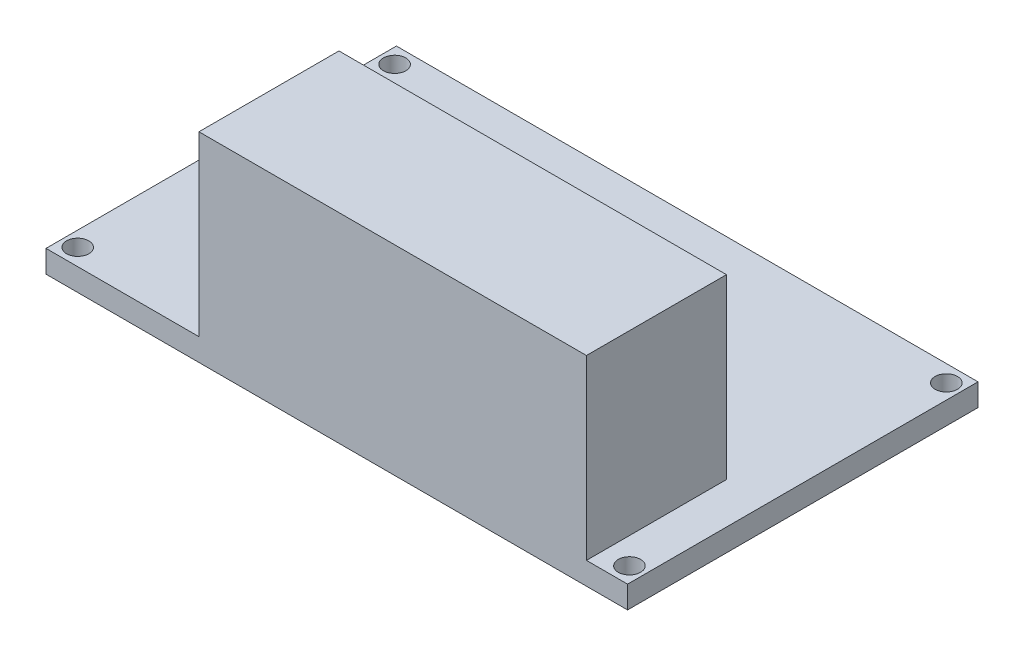
ISO-10303-21;
HEADER;
FILE_DESCRIPTION(('STEP AP214'),'2;1');
FILE_NAME('part.step','',(''),(''),'','','');
FILE_SCHEMA(('AUTOMOTIVE_DESIGN { 1 0 10303 214 1 1 1 1 }'));
ENDSEC;
DATA;
#1=APPLICATION_CONTEXT('core data for automotive mechanical design processes');
#2=APPLICATION_PROTOCOL_DEFINITION('international standard','automotive_design',2000,#1);
#3=PRODUCT_CONTEXT('',#1,'mechanical');
#4=PRODUCT('Part','Part','',(#3));
#5=PRODUCT_RELATED_PRODUCT_CATEGORY('part','',(#4));
#6=PRODUCT_DEFINITION_FORMATION('','',#4);
#7=PRODUCT_DEFINITION_CONTEXT('part definition',#1,'design');
#8=PRODUCT_DEFINITION('design','',#6,#7);
#9=PRODUCT_DEFINITION_SHAPE('','',#8);
#10=(LENGTH_UNIT() NAMED_UNIT(*) SI_UNIT(.MILLI.,.METRE.));
#11=(NAMED_UNIT(*) PLANE_ANGLE_UNIT() SI_UNIT($,.RADIAN.));
#12=(NAMED_UNIT(*) SI_UNIT($,.STERADIAN.) SOLID_ANGLE_UNIT());
#13=UNCERTAINTY_MEASURE_WITH_UNIT(LENGTH_MEASURE(1.E-05),#10,'distance_accuracy_value','');
#14=(GEOMETRIC_REPRESENTATION_CONTEXT(3) GLOBAL_UNCERTAINTY_ASSIGNED_CONTEXT((#13)) GLOBAL_UNIT_ASSIGNED_CONTEXT((#10,
#11,#12)) REPRESENTATION_CONTEXT('',''));
#15=CARTESIAN_POINT('',(0.,0.,0.));
#16=DIRECTION('',(0.,0.,1.));
#17=DIRECTION('',(1.,0.,0.));
#18=AXIS2_PLACEMENT_3D('',#15,#16,#17);
#19=CARTESIAN_POINT('',(0.,3.81,0.));
#20=DIRECTION('',(0.,-1.,0.));
#21=DIRECTION('',(0.,0.,-1.));
#22=AXIS2_PLACEMENT_3D('',#19,#20,#21);
#23=PLANE('',#22);
#24=CARTESIAN_POINT('',(-46.99,3.81,-26.9875));
#25=DIRECTION('',(0.,-1.,0.));
#26=DIRECTION('',(0.,0.,-1.));
#27=AXIS2_PLACEMENT_3D('',#24,#25,#26);
#28=CIRCLE('',#27,1.905);
#29=CARTESIAN_POINT('',(-46.99,3.81,-25.0825));
#30=VERTEX_POINT('',#29);
#31=EDGE_CURVE('E146',#30,#30,#28,.T.);
#32=ORIENTED_EDGE('',*,*,#31,.T.);
#33=EDGE_LOOP('',(#32));
#34=FACE_BOUND('',#33,.T.);
#35=CARTESIAN_POINT('',(46.99,3.81,-26.9875));
#36=DIRECTION('',(0.,-1.,0.));
#37=DIRECTION('',(0.,0.,-1.));
#38=AXIS2_PLACEMENT_3D('',#35,#36,#37);
#39=CIRCLE('',#38,1.905);
#40=CARTESIAN_POINT('',(46.99,3.81,-25.0825));
#41=VERTEX_POINT('',#40);
#42=EDGE_CURVE('E149',#41,#41,#39,.T.);
#43=ORIENTED_EDGE('',*,*,#42,.T.);
#44=EDGE_LOOP('',(#43));
#45=FACE_BOUND('',#44,.T.);
#46=CARTESIAN_POINT('',(46.99,3.81,26.9875));
#47=DIRECTION('',(0.,-1.,0.));
#48=DIRECTION('',(0.,0.,-1.));
#49=AXIS2_PLACEMENT_3D('',#46,#47,#48);
#50=CIRCLE('',#49,1.90500000000001);
#51=CARTESIAN_POINT('',(46.99,3.81,28.8925));
#52=VERTEX_POINT('',#51);
#53=EDGE_CURVE('E152',#52,#52,#50,.T.);
#54=ORIENTED_EDGE('',*,*,#53,.T.);
#55=EDGE_LOOP('',(#54));
#56=FACE_BOUND('',#55,.T.);
#57=CARTESIAN_POINT('',(-46.99,3.81,26.9875));
#58=DIRECTION('',(0.,-1.,0.));
#59=DIRECTION('',(0.,0.,-1.));
#60=AXIS2_PLACEMENT_3D('',#57,#58,#59);
#61=CIRCLE('',#60,1.90500000000001);
#62=CARTESIAN_POINT('',(-46.99,3.81,28.8925));
#63=VERTEX_POINT('',#62);
#64=EDGE_CURVE('E155',#63,#63,#61,.T.);
#65=ORIENTED_EDGE('',*,*,#64,.T.);
#66=EDGE_LOOP('',(#65));
#67=FACE_BOUND('',#66,.T.);
#68=DIRECTION('',(0.,0.,-1.));
#69=VECTOR('',#68,1.);
#70=CARTESIAN_POINT('',(42.5256241387592,3.81,29.845));
#71=LINE('',#70,#69);
#72=CARTESIAN_POINT('',(42.5256241387592,3.81,29.845));
#73=VERTEX_POINT('',#72);
#74=CARTESIAN_POINT('',(42.5256241387592,3.81,5.99591146032266));
#75=VERTEX_POINT('',#74);
#76=EDGE_CURVE('E64',#73,#75,#71,.T.);
#77=ORIENTED_EDGE('',*,*,#76,.F.);
#78=DIRECTION('',(1.,0.,0.));
#79=VECTOR('',#78,1.);
#80=CARTESIAN_POINT('',(-49.53,3.81,29.845));
#81=LINE('',#80,#79);
#82=CARTESIAN_POINT('',(49.53,3.81,29.845));
#83=VERTEX_POINT('',#82);
#84=EDGE_CURVE('E167',#73,#83,#81,.T.);
#85=ORIENTED_EDGE('',*,*,#84,.T.);
#86=DIRECTION('',(0.,0.,-1.));
#87=VECTOR('',#86,1.);
#88=CARTESIAN_POINT('',(49.53,3.81,29.845));
#89=LINE('',#88,#87);
#90=CARTESIAN_POINT('',(49.53,3.81,-29.845));
#91=VERTEX_POINT('',#90);
#92=EDGE_CURVE('E159',#83,#91,#89,.T.);
#93=ORIENTED_EDGE('',*,*,#92,.T.);
#94=DIRECTION('',(-1.,0.,0.));
#95=VECTOR('',#94,1.);
#96=CARTESIAN_POINT('',(-49.53,3.81,-29.845));
#97=LINE('',#96,#95);
#98=CARTESIAN_POINT('',(-49.53,3.81,-29.845));
#99=VERTEX_POINT('',#98);
#100=EDGE_CURVE('E162',#91,#99,#97,.T.);
#101=ORIENTED_EDGE('',*,*,#100,.T.);
#102=DIRECTION('',(0.,0.,1.));
#103=VECTOR('',#102,1.);
#104=CARTESIAN_POINT('',(-49.53,3.81,29.845));
#105=LINE('',#104,#103);
#106=CARTESIAN_POINT('',(-49.53,3.81,29.845));
#107=VERTEX_POINT('',#106);
#108=EDGE_CURVE('E165',#99,#107,#105,.T.);
#109=ORIENTED_EDGE('',*,*,#108,.T.);
#110=CARTESIAN_POINT('',(-23.4797877353813,3.81,29.845));
#111=VERTEX_POINT('',#110);
#112=EDGE_CURVE('E168',#107,#111,#81,.T.);
#113=ORIENTED_EDGE('',*,*,#112,.T.);
#114=DIRECTION('',(0.,0.,1.));
#115=VECTOR('',#114,1.);
#116=CARTESIAN_POINT('',(-23.4797877353813,3.81,29.845));
#117=LINE('',#116,#115);
#118=CARTESIAN_POINT('',(-23.4797877353813,3.81,5.99591146032266));
#119=VERTEX_POINT('',#118);
#120=EDGE_CURVE('E126',#119,#111,#117,.T.);
#121=ORIENTED_EDGE('',*,*,#120,.F.);
#122=DIRECTION('',(-1.,0.,0.));
#123=VECTOR('',#122,1.);
#124=CARTESIAN_POINT('',(42.5256241387592,3.81,5.99591146032266));
#125=LINE('',#124,#123);
#126=EDGE_CURVE('E59',#75,#119,#125,.T.);
#127=ORIENTED_EDGE('',*,*,#126,.F.);
#128=EDGE_LOOP('',(#77,#85,#93,#101,#109,#113,#121,#127));
#129=FACE_BOUND('',#128,.T.);
#130=ADVANCED_FACE('F44',(#34,#45,#56,#67,#129),#23,.F.);
#131=CARTESIAN_POINT('',(49.53,3.81,29.845));
#132=DIRECTION('',(-1.,0.,0.));
#133=DIRECTION('',(0.,0.,1.));
#134=AXIS2_PLACEMENT_3D('',#131,#132,#133);
#135=PLANE('',#134);
#136=DIRECTION('',(0.,0.,-1.));
#137=VECTOR('',#136,1.);
#138=CARTESIAN_POINT('',(49.53,0.,29.845));
#139=LINE('',#138,#137);
#140=CARTESIAN_POINT('',(49.53,0.,29.845));
#141=VERTEX_POINT('',#140);
#142=CARTESIAN_POINT('',(49.53,0.,-29.845));
#143=VERTEX_POINT('',#142);
#144=EDGE_CURVE('E158',#141,#143,#139,.T.);
#145=ORIENTED_EDGE('',*,*,#144,.T.);
#146=DIRECTION('',(0.,-1.,0.));
#147=VECTOR('',#146,1.);
#148=CARTESIAN_POINT('',(49.53,3.81,-29.845));
#149=LINE('',#148,#147);
#150=EDGE_CURVE('E11',#91,#143,#149,.T.);
#151=ORIENTED_EDGE('',*,*,#150,.F.);
#152=ORIENTED_EDGE('',*,*,#92,.F.);
#153=DIRECTION('',(0.,-1.,0.));
#154=VECTOR('',#153,1.);
#155=CARTESIAN_POINT('',(49.53,3.81,29.845));
#156=LINE('',#155,#154);
#157=EDGE_CURVE('E170',#83,#141,#156,.T.);
#158=ORIENTED_EDGE('',*,*,#157,.T.);
#159=EDGE_LOOP('',(#145,#151,#152,#158));
#160=FACE_BOUND('',#159,.T.);
#161=ADVANCED_FACE('F46',(#160),#135,.F.);
#162=CARTESIAN_POINT('',(-49.53,3.81,-29.845));
#163=DIRECTION('',(0.,0.,1.));
#164=DIRECTION('',(1.,0.,0.));
#165=AXIS2_PLACEMENT_3D('',#162,#163,#164);
#166=PLANE('',#165);
#167=DIRECTION('',(-1.,0.,0.));
#168=VECTOR('',#167,1.);
#169=CARTESIAN_POINT('',(-49.53,0.,-29.845));
#170=LINE('',#169,#168);
#171=CARTESIAN_POINT('',(-49.53,0.,-29.845));
#172=VERTEX_POINT('',#171);
#173=EDGE_CURVE('E173',#143,#172,#170,.T.);
#174=ORIENTED_EDGE('',*,*,#173,.T.);
#175=DIRECTION('',(0.,-1.,0.));
#176=VECTOR('',#175,1.);
#177=CARTESIAN_POINT('',(-49.53,3.81,-29.845));
#178=LINE('',#177,#176);
#179=EDGE_CURVE('E52',#99,#172,#178,.T.);
#180=ORIENTED_EDGE('',*,*,#179,.F.);
#181=ORIENTED_EDGE('',*,*,#100,.F.);
#182=ORIENTED_EDGE('',*,*,#150,.T.);
#183=EDGE_LOOP('',(#174,#180,#181,#182));
#184=FACE_BOUND('',#183,.T.);
#185=ADVANCED_FACE('F229',(#184),#166,.F.);
#186=CARTESIAN_POINT('',(-49.53,3.81,29.845));
#187=DIRECTION('',(1.,0.,0.));
#188=DIRECTION('',(0.,0.,-1.));
#189=AXIS2_PLACEMENT_3D('',#186,#187,#188);
#190=PLANE('',#189);
#191=DIRECTION('',(0.,0.,1.));
#192=VECTOR('',#191,1.);
#193=CARTESIAN_POINT('',(-49.53,0.,29.845));
#194=LINE('',#193,#192);
#195=CARTESIAN_POINT('',(-49.53,0.,29.845));
#196=VERTEX_POINT('',#195);
#197=EDGE_CURVE('E175',#172,#196,#194,.T.);
#198=ORIENTED_EDGE('',*,*,#197,.T.);
#199=DIRECTION('',(0.,-1.,0.));
#200=VECTOR('',#199,1.);
#201=CARTESIAN_POINT('',(-49.53,3.81,29.845));
#202=LINE('',#201,#200);
#203=EDGE_CURVE('E180',#107,#196,#202,.T.);
#204=ORIENTED_EDGE('',*,*,#203,.F.);
#205=ORIENTED_EDGE('',*,*,#108,.F.);
#206=ORIENTED_EDGE('',*,*,#179,.T.);
#207=EDGE_LOOP('',(#198,#204,#205,#206));
#208=FACE_BOUND('',#207,.T.);
#209=ADVANCED_FACE('F187',(#208),#190,.F.);
#210=CARTESIAN_POINT('',(-49.53,3.81,29.845));
#211=DIRECTION('',(0.,0.,-1.));
#212=DIRECTION('',(-1.,0.,0.));
#213=AXIS2_PLACEMENT_3D('',#210,#211,#212);
#214=PLANE('',#213);
#215=DIRECTION('',(1.,0.,0.));
#216=VECTOR('',#215,1.);
#217=CARTESIAN_POINT('',(-49.53,0.,29.845));
#218=LINE('',#217,#216);
#219=EDGE_CURVE('E163',#196,#141,#218,.T.);
#220=ORIENTED_EDGE('',*,*,#219,.T.);
#221=ORIENTED_EDGE('',*,*,#157,.F.);
#222=ORIENTED_EDGE('',*,*,#84,.F.);
#223=DIRECTION('',(0.,-1.,0.));
#224=VECTOR('',#223,1.);
#225=CARTESIAN_POINT('',(42.5256241387592,34.036,29.845));
#226=LINE('',#225,#224);
#227=CARTESIAN_POINT('',(42.5256241387592,34.036,29.845));
#228=VERTEX_POINT('',#227);
#229=EDGE_CURVE('E201',#228,#73,#226,.T.);
#230=ORIENTED_EDGE('',*,*,#229,.F.);
#231=DIRECTION('',(1.,0.,0.));
#232=VECTOR('',#231,1.);
#233=CARTESIAN_POINT('',(42.5256241387592,34.036,29.845));
#234=LINE('',#233,#232);
#235=CARTESIAN_POINT('',(-23.4797877353813,34.036,29.845));
#236=VERTEX_POINT('',#235);
#237=EDGE_CURVE('E122',#236,#228,#234,.T.);
#238=ORIENTED_EDGE('',*,*,#237,.F.);
#239=DIRECTION('',(0.,-1.,0.));
#240=VECTOR('',#239,1.);
#241=CARTESIAN_POINT('',(-23.4797877353813,34.036,29.845));
#242=LINE('',#241,#240);
#243=EDGE_CURVE('E134',#236,#111,#242,.T.);
#244=ORIENTED_EDGE('',*,*,#243,.T.);
#245=ORIENTED_EDGE('',*,*,#112,.F.);
#246=ORIENTED_EDGE('',*,*,#203,.T.);
#247=EDGE_LOOP('',(#220,#221,#222,#230,#238,#244,#245,#246));
#248=FACE_BOUND('',#247,.T.);
#249=ADVANCED_FACE('F196',(#248),#214,.F.);
#250=CARTESIAN_POINT('',(0.,0.,0.));
#251=DIRECTION('',(0.,-1.,0.));
#252=DIRECTION('',(0.,0.,-1.));
#253=AXIS2_PLACEMENT_3D('',#250,#251,#252);
#254=PLANE('',#253);
#255=CARTESIAN_POINT('',(-46.99,0.,26.9875));
#256=DIRECTION('',(0.,1.,0.));
#257=DIRECTION('',(0.,0.,1.));
#258=AXIS2_PLACEMENT_3D('',#255,#256,#257);
#259=CIRCLE('',#258,1.90500000000001);
#260=CARTESIAN_POINT('',(-46.99,0.,28.8925));
#261=VERTEX_POINT('',#260);
#262=EDGE_CURVE('E129',#261,#261,#259,.T.);
#263=ORIENTED_EDGE('',*,*,#262,.T.);
#264=EDGE_LOOP('',(#263));
#265=FACE_BOUND('',#264,.T.);
#266=CARTESIAN_POINT('',(46.99,0.,26.9875));
#267=DIRECTION('',(0.,1.,0.));
#268=DIRECTION('',(0.,0.,1.));
#269=AXIS2_PLACEMENT_3D('',#266,#267,#268);
#270=CIRCLE('',#269,1.90500000000001);
#271=CARTESIAN_POINT('',(46.99,0.,28.8925));
#272=VERTEX_POINT('',#271);
#273=EDGE_CURVE('E132',#272,#272,#270,.T.);
#274=ORIENTED_EDGE('',*,*,#273,.T.);
#275=EDGE_LOOP('',(#274));
#276=FACE_BOUND('',#275,.T.);
#277=CARTESIAN_POINT('',(46.99,0.,-26.9875));
#278=DIRECTION('',(0.,1.,0.));
#279=DIRECTION('',(0.,0.,1.));
#280=AXIS2_PLACEMENT_3D('',#277,#278,#279);
#281=CIRCLE('',#280,1.905);
#282=CARTESIAN_POINT('',(46.99,0.,-25.0825));
#283=VERTEX_POINT('',#282);
#284=EDGE_CURVE('E138',#283,#283,#281,.T.);
#285=ORIENTED_EDGE('',*,*,#284,.T.);
#286=EDGE_LOOP('',(#285));
#287=FACE_BOUND('',#286,.T.);
#288=CARTESIAN_POINT('',(-46.99,0.,-26.9875));
#289=DIRECTION('',(0.,1.,0.));
#290=DIRECTION('',(0.,0.,1.));
#291=AXIS2_PLACEMENT_3D('',#288,#289,#290);
#292=CIRCLE('',#291,1.905);
#293=CARTESIAN_POINT('',(-46.99,0.,-25.0825));
#294=VERTEX_POINT('',#293);
#295=EDGE_CURVE('E141',#294,#294,#292,.T.);
#296=ORIENTED_EDGE('',*,*,#295,.T.);
#297=EDGE_LOOP('',(#296));
#298=FACE_BOUND('',#297,.T.);
#299=ORIENTED_EDGE('',*,*,#144,.F.);
#300=ORIENTED_EDGE('',*,*,#219,.F.);
#301=ORIENTED_EDGE('',*,*,#197,.F.);
#302=ORIENTED_EDGE('',*,*,#173,.F.);
#303=EDGE_LOOP('',(#299,#300,#301,#302));
#304=FACE_BOUND('',#303,.T.);
#305=ADVANCED_FACE('F193',(#265,#276,#287,#298,#304),#254,.T.);
#306=CARTESIAN_POINT('',(-46.99,0.,-26.9875));
#307=DIRECTION('',(0.,1.,0.));
#308=DIRECTION('',(0.,0.,1.));
#309=AXIS2_PLACEMENT_3D('',#306,#307,#308);
#310=CYLINDRICAL_SURFACE('',#309,1.905);
#311=CARTESIAN_POINT('',(-46.99,0.,-25.0825));
#312=CARTESIAN_POINT('',(-46.99,0.0396874999999999,-25.0825));
#313=CARTESIAN_POINT('',(-46.99,0.079375,-25.0825));
#314=CARTESIAN_POINT('',(-46.99,0.15875,-25.0825));
#315=CARTESIAN_POINT('',(-46.99,0.1984375,-25.0825));
#316=CARTESIAN_POINT('',(-46.99,0.2778125,-25.0825));
#317=CARTESIAN_POINT('',(-46.99,0.3175,-25.0825));
#318=CARTESIAN_POINT('',(-46.99,0.396875,-25.0825));
#319=CARTESIAN_POINT('',(-46.99,0.4365625,-25.0825));
#320=CARTESIAN_POINT('',(-46.99,0.5159375,-25.0825));
#321=CARTESIAN_POINT('',(-46.99,0.555625,-25.0825));
#322=CARTESIAN_POINT('',(-46.99,0.635,-25.0825));
#323=CARTESIAN_POINT('',(-46.99,0.6746875,-25.0825));
#324=CARTESIAN_POINT('',(-46.99,0.7540625,-25.0825));
#325=CARTESIAN_POINT('',(-46.99,0.79375,-25.0825));
#326=CARTESIAN_POINT('',(-46.99,0.873125,-25.0825));
#327=CARTESIAN_POINT('',(-46.99,0.9128125,-25.0825));
#328=CARTESIAN_POINT('',(-46.99,0.9921875,-25.0825));
#329=CARTESIAN_POINT('',(-46.99,1.031875,-25.0825));
#330=CARTESIAN_POINT('',(-46.99,1.11125,-25.0825));
#331=CARTESIAN_POINT('',(-46.99,1.1509375,-25.0825));
#332=CARTESIAN_POINT('',(-46.99,1.2303125,-25.0825));
#333=CARTESIAN_POINT('',(-46.99,1.27,-25.0825));
#334=CARTESIAN_POINT('',(-46.99,1.349375,-25.0825));
#335=CARTESIAN_POINT('',(-46.99,1.3890625,-25.0825));
#336=CARTESIAN_POINT('',(-46.99,1.4684375,-25.0825));
#337=CARTESIAN_POINT('',(-46.99,1.508125,-25.0825));
#338=CARTESIAN_POINT('',(-46.99,1.5875,-25.0825));
#339=CARTESIAN_POINT('',(-46.99,1.6271875,-25.0825));
#340=CARTESIAN_POINT('',(-46.99,1.7065625,-25.0825));
#341=CARTESIAN_POINT('',(-46.99,1.74625,-25.0825));
#342=CARTESIAN_POINT('',(-46.99,1.825625,-25.0825));
#343=CARTESIAN_POINT('',(-46.99,1.8653125,-25.0825));
#344=CARTESIAN_POINT('',(-46.99,1.9446875,-25.0825));
#345=CARTESIAN_POINT('',(-46.99,1.984375,-25.0825));
#346=CARTESIAN_POINT('',(-46.99,2.06375,-25.0825));
#347=CARTESIAN_POINT('',(-46.99,2.1034375,-25.0825));
#348=CARTESIAN_POINT('',(-46.99,2.1828125,-25.0825));
#349=CARTESIAN_POINT('',(-46.99,2.2225,-25.0825));
#350=CARTESIAN_POINT('',(-46.99,2.301875,-25.0825));
#351=CARTESIAN_POINT('',(-46.99,2.3415625,-25.0825));
#352=CARTESIAN_POINT('',(-46.99,2.4209375,-25.0825));
#353=CARTESIAN_POINT('',(-46.99,2.460625,-25.0825));
#354=CARTESIAN_POINT('',(-46.99,2.54,-25.0825));
#355=CARTESIAN_POINT('',(-46.99,2.5796875,-25.0825));
#356=CARTESIAN_POINT('',(-46.99,2.6590625,-25.0825));
#357=CARTESIAN_POINT('',(-46.99,2.69875,-25.0825));
#358=CARTESIAN_POINT('',(-46.99,2.778125,-25.0825));
#359=CARTESIAN_POINT('',(-46.99,2.8178125,-25.0825));
#360=CARTESIAN_POINT('',(-46.99,2.8971875,-25.0825));
#361=CARTESIAN_POINT('',(-46.99,2.936875,-25.0825));
#362=CARTESIAN_POINT('',(-46.99,3.01625,-25.0825));
#363=CARTESIAN_POINT('',(-46.99,3.0559375,-25.0825));
#364=CARTESIAN_POINT('',(-46.99,3.1353125,-25.0825));
#365=CARTESIAN_POINT('',(-46.99,3.175,-25.0825));
#366=CARTESIAN_POINT('',(-46.99,3.254375,-25.0825));
#367=CARTESIAN_POINT('',(-46.99,3.2940625,-25.0825));
#368=CARTESIAN_POINT('',(-46.99,3.3734375,-25.0825));
#369=CARTESIAN_POINT('',(-46.99,3.413125,-25.0825));
#370=CARTESIAN_POINT('',(-46.99,3.4925,-25.0825));
#371=CARTESIAN_POINT('',(-46.99,3.5321875,-25.0825));
#372=CARTESIAN_POINT('',(-46.99,3.6115625,-25.0825));
#373=CARTESIAN_POINT('',(-46.99,3.65125,-25.0825));
#374=CARTESIAN_POINT('',(-46.99,3.730625,-25.0825));
#375=CARTESIAN_POINT('',(-46.99,3.7703125,-25.0825));
#376=CARTESIAN_POINT('',(-46.99,3.81,-25.0825));
#377=B_SPLINE_CURVE_WITH_KNOTS('',3,(#311,#312,#313,#314,#315,#316,#317,#318,#319,#320,#321,
#322,#323,#324,#325,#326,#327,#328,#329,#330,#331,#332,#333,#334,#335,#336,#337,#338,#339,#340,
#341,#342,#343,#344,#345,#346,#347,#348,#349,#350,#351,#352,#353,#354,#355,#356,#357,#358,#359,
#360,#361,#362,#363,#364,#365,#366,#367,#368,#369,#370,#371,#372,#373,#374,#375,#376),
.UNSPECIFIED.,.F.,.F.,(4,2,2,2,2,2,2,2,2,2,2,2,2,2,2,2,2,2,2,2,2,2,2,2,2,2,2,2,2,2,2,2,4),(0.,
0.1190625,0.238125,0.3571875,0.47625,0.5953125,0.714375,0.8334375,0.9525,1.0715625,1.190625,
1.3096875,1.42875,1.5478125,1.666875,1.7859375,1.905,2.0240625,2.143125,2.2621875,2.38125,
2.5003125,2.619375,2.7384375,2.8575,2.9765625,3.095625,3.2146875,3.33375,3.4528125,3.571875,
3.6909375,3.81),.UNSPECIFIED.);
#378=EDGE_CURVE('BSEAM233',#294,#30,#377,.T.);
#379=ORIENTED_EDGE('',*,*,#295,.F.);
#380=ORIENTED_EDGE('',*,*,#31,.F.);
#381=ORIENTED_EDGE('',*,*,#378,.T.);
#382=ORIENTED_EDGE('',*,*,#378,.F.);
#383=EDGE_LOOP('',(#379,#381,#380,#382));
#384=FACE_BOUND('',#383,.T.);
#385=ADVANCED_FACE('F233',(#384),#310,.F.);
#386=CARTESIAN_POINT('',(46.99,0.,-26.9875));
#387=DIRECTION('',(0.,1.,0.));
#388=DIRECTION('',(0.,0.,1.));
#389=AXIS2_PLACEMENT_3D('',#386,#387,#388);
#390=CYLINDRICAL_SURFACE('',#389,1.905);
#391=CARTESIAN_POINT('',(46.99,0.,-25.0825));
#392=CARTESIAN_POINT('',(46.99,0.0396874999999999,-25.0825));
#393=CARTESIAN_POINT('',(46.99,0.079375,-25.0825));
#394=CARTESIAN_POINT('',(46.99,0.15875,-25.0825));
#395=CARTESIAN_POINT('',(46.99,0.1984375,-25.0825));
#396=CARTESIAN_POINT('',(46.99,0.2778125,-25.0825));
#397=CARTESIAN_POINT('',(46.99,0.3175,-25.0825));
#398=CARTESIAN_POINT('',(46.99,0.396875,-25.0825));
#399=CARTESIAN_POINT('',(46.99,0.4365625,-25.0825));
#400=CARTESIAN_POINT('',(46.99,0.5159375,-25.0825));
#401=CARTESIAN_POINT('',(46.99,0.555625,-25.0825));
#402=CARTESIAN_POINT('',(46.99,0.635,-25.0825));
#403=CARTESIAN_POINT('',(46.99,0.6746875,-25.0825));
#404=CARTESIAN_POINT('',(46.99,0.7540625,-25.0825));
#405=CARTESIAN_POINT('',(46.99,0.79375,-25.0825));
#406=CARTESIAN_POINT('',(46.99,0.873125,-25.0825));
#407=CARTESIAN_POINT('',(46.99,0.9128125,-25.0825));
#408=CARTESIAN_POINT('',(46.99,0.9921875,-25.0825));
#409=CARTESIAN_POINT('',(46.99,1.031875,-25.0825));
#410=CARTESIAN_POINT('',(46.99,1.11125,-25.0825));
#411=CARTESIAN_POINT('',(46.99,1.1509375,-25.0825));
#412=CARTESIAN_POINT('',(46.99,1.2303125,-25.0825));
#413=CARTESIAN_POINT('',(46.99,1.27,-25.0825));
#414=CARTESIAN_POINT('',(46.99,1.349375,-25.0825));
#415=CARTESIAN_POINT('',(46.99,1.3890625,-25.0825));
#416=CARTESIAN_POINT('',(46.99,1.4684375,-25.0825));
#417=CARTESIAN_POINT('',(46.99,1.508125,-25.0825));
#418=CARTESIAN_POINT('',(46.99,1.5875,-25.0825));
#419=CARTESIAN_POINT('',(46.99,1.6271875,-25.0825));
#420=CARTESIAN_POINT('',(46.99,1.7065625,-25.0825));
#421=CARTESIAN_POINT('',(46.99,1.74625,-25.0825));
#422=CARTESIAN_POINT('',(46.99,1.825625,-25.0825));
#423=CARTESIAN_POINT('',(46.99,1.8653125,-25.0825));
#424=CARTESIAN_POINT('',(46.99,1.9446875,-25.0825));
#425=CARTESIAN_POINT('',(46.99,1.984375,-25.0825));
#426=CARTESIAN_POINT('',(46.99,2.06375,-25.0825));
#427=CARTESIAN_POINT('',(46.99,2.1034375,-25.0825));
#428=CARTESIAN_POINT('',(46.99,2.1828125,-25.0825));
#429=CARTESIAN_POINT('',(46.99,2.2225,-25.0825));
#430=CARTESIAN_POINT('',(46.99,2.301875,-25.0825));
#431=CARTESIAN_POINT('',(46.99,2.3415625,-25.0825));
#432=CARTESIAN_POINT('',(46.99,2.4209375,-25.0825));
#433=CARTESIAN_POINT('',(46.99,2.460625,-25.0825));
#434=CARTESIAN_POINT('',(46.99,2.54,-25.0825));
#435=CARTESIAN_POINT('',(46.99,2.5796875,-25.0825));
#436=CARTESIAN_POINT('',(46.99,2.6590625,-25.0825));
#437=CARTESIAN_POINT('',(46.99,2.69875,-25.0825));
#438=CARTESIAN_POINT('',(46.99,2.778125,-25.0825));
#439=CARTESIAN_POINT('',(46.99,2.8178125,-25.0825));
#440=CARTESIAN_POINT('',(46.99,2.8971875,-25.0825));
#441=CARTESIAN_POINT('',(46.99,2.936875,-25.0825));
#442=CARTESIAN_POINT('',(46.99,3.01625,-25.0825));
#443=CARTESIAN_POINT('',(46.99,3.0559375,-25.0825));
#444=CARTESIAN_POINT('',(46.99,3.1353125,-25.0825));
#445=CARTESIAN_POINT('',(46.99,3.175,-25.0825));
#446=CARTESIAN_POINT('',(46.99,3.254375,-25.0825));
#447=CARTESIAN_POINT('',(46.99,3.2940625,-25.0825));
#448=CARTESIAN_POINT('',(46.99,3.3734375,-25.0825));
#449=CARTESIAN_POINT('',(46.99,3.413125,-25.0825));
#450=CARTESIAN_POINT('',(46.99,3.4925,-25.0825));
#451=CARTESIAN_POINT('',(46.99,3.5321875,-25.0825));
#452=CARTESIAN_POINT('',(46.99,3.6115625,-25.0825));
#453=CARTESIAN_POINT('',(46.99,3.65125,-25.0825));
#454=CARTESIAN_POINT('',(46.99,3.730625,-25.0825));
#455=CARTESIAN_POINT('',(46.99,3.7703125,-25.0825));
#456=CARTESIAN_POINT('',(46.99,3.81,-25.0825));
#457=B_SPLINE_CURVE_WITH_KNOTS('',3,(#391,#392,#393,#394,#395,#396,#397,#398,#399,#400,#401,
#402,#403,#404,#405,#406,#407,#408,#409,#410,#411,#412,#413,#414,#415,#416,#417,#418,#419,#420,
#421,#422,#423,#424,#425,#426,#427,#428,#429,#430,#431,#432,#433,#434,#435,#436,#437,#438,#439,
#440,#441,#442,#443,#444,#445,#446,#447,#448,#449,#450,#451,#452,#453,#454,#455,#456),
.UNSPECIFIED.,.F.,.F.,(4,2,2,2,2,2,2,2,2,2,2,2,2,2,2,2,2,2,2,2,2,2,2,2,2,2,2,2,2,2,2,2,4),(0.,
0.1190625,0.238125,0.3571875,0.47625,0.5953125,0.714375,0.8334375,0.9525,1.0715625,1.190625,
1.3096875,1.42875,1.5478125,1.666875,1.7859375,1.905,2.0240625,2.143125,2.2621875,2.38125,
2.5003125,2.619375,2.7384375,2.8575,2.9765625,3.095625,3.2146875,3.33375,3.4528125,3.571875,
3.6909375,3.81),.UNSPECIFIED.);
#458=EDGE_CURVE('BSEAM263',#283,#41,#457,.T.);
#459=ORIENTED_EDGE('',*,*,#284,.F.);
#460=ORIENTED_EDGE('',*,*,#42,.F.);
#461=ORIENTED_EDGE('',*,*,#458,.T.);
#462=ORIENTED_EDGE('',*,*,#458,.F.);
#463=EDGE_LOOP('',(#459,#461,#460,#462));
#464=FACE_BOUND('',#463,.T.);
#465=ADVANCED_FACE('F263',(#464),#390,.F.);
#466=CARTESIAN_POINT('',(46.99,0.,26.9875));
#467=DIRECTION('',(0.,1.,0.));
#468=DIRECTION('',(0.,0.,1.));
#469=AXIS2_PLACEMENT_3D('',#466,#467,#468);
#470=CYLINDRICAL_SURFACE('',#469,1.90500000000001);
#471=CARTESIAN_POINT('',(46.99,0.,28.8925));
#472=CARTESIAN_POINT('',(46.99,0.0396874999999999,28.8925));
#473=CARTESIAN_POINT('',(46.99,0.079375,28.8925));
#474=CARTESIAN_POINT('',(46.99,0.15875,28.8925));
#475=CARTESIAN_POINT('',(46.99,0.1984375,28.8925));
#476=CARTESIAN_POINT('',(46.99,0.2778125,28.8925));
#477=CARTESIAN_POINT('',(46.99,0.3175,28.8925));
#478=CARTESIAN_POINT('',(46.99,0.396875,28.8925));
#479=CARTESIAN_POINT('',(46.99,0.4365625,28.8925));
#480=CARTESIAN_POINT('',(46.99,0.5159375,28.8925));
#481=CARTESIAN_POINT('',(46.99,0.555625,28.8925));
#482=CARTESIAN_POINT('',(46.99,0.635,28.8925));
#483=CARTESIAN_POINT('',(46.99,0.6746875,28.8925));
#484=CARTESIAN_POINT('',(46.99,0.7540625,28.8925));
#485=CARTESIAN_POINT('',(46.99,0.79375,28.8925));
#486=CARTESIAN_POINT('',(46.99,0.873125,28.8925));
#487=CARTESIAN_POINT('',(46.99,0.9128125,28.8925));
#488=CARTESIAN_POINT('',(46.99,0.9921875,28.8925));
#489=CARTESIAN_POINT('',(46.99,1.031875,28.8925));
#490=CARTESIAN_POINT('',(46.99,1.11125,28.8925));
#491=CARTESIAN_POINT('',(46.99,1.1509375,28.8925));
#492=CARTESIAN_POINT('',(46.99,1.2303125,28.8925));
#493=CARTESIAN_POINT('',(46.99,1.27,28.8925));
#494=CARTESIAN_POINT('',(46.99,1.349375,28.8925));
#495=CARTESIAN_POINT('',(46.99,1.3890625,28.8925));
#496=CARTESIAN_POINT('',(46.99,1.4684375,28.8925));
#497=CARTESIAN_POINT('',(46.99,1.508125,28.8925));
#498=CARTESIAN_POINT('',(46.99,1.5875,28.8925));
#499=CARTESIAN_POINT('',(46.99,1.6271875,28.8925));
#500=CARTESIAN_POINT('',(46.99,1.7065625,28.8925));
#501=CARTESIAN_POINT('',(46.99,1.74625,28.8925));
#502=CARTESIAN_POINT('',(46.99,1.825625,28.8925));
#503=CARTESIAN_POINT('',(46.99,1.8653125,28.8925));
#504=CARTESIAN_POINT('',(46.99,1.9446875,28.8925));
#505=CARTESIAN_POINT('',(46.99,1.984375,28.8925));
#506=CARTESIAN_POINT('',(46.99,2.06375,28.8925));
#507=CARTESIAN_POINT('',(46.99,2.1034375,28.8925));
#508=CARTESIAN_POINT('',(46.99,2.1828125,28.8925));
#509=CARTESIAN_POINT('',(46.99,2.2225,28.8925));
#510=CARTESIAN_POINT('',(46.99,2.301875,28.8925));
#511=CARTESIAN_POINT('',(46.99,2.3415625,28.8925));
#512=CARTESIAN_POINT('',(46.99,2.4209375,28.8925));
#513=CARTESIAN_POINT('',(46.99,2.460625,28.8925));
#514=CARTESIAN_POINT('',(46.99,2.54,28.8925));
#515=CARTESIAN_POINT('',(46.99,2.5796875,28.8925));
#516=CARTESIAN_POINT('',(46.99,2.6590625,28.8925));
#517=CARTESIAN_POINT('',(46.99,2.69875,28.8925));
#518=CARTESIAN_POINT('',(46.99,2.778125,28.8925));
#519=CARTESIAN_POINT('',(46.99,2.8178125,28.8925));
#520=CARTESIAN_POINT('',(46.99,2.8971875,28.8925));
#521=CARTESIAN_POINT('',(46.99,2.936875,28.8925));
#522=CARTESIAN_POINT('',(46.99,3.01625,28.8925));
#523=CARTESIAN_POINT('',(46.99,3.0559375,28.8925));
#524=CARTESIAN_POINT('',(46.99,3.1353125,28.8925));
#525=CARTESIAN_POINT('',(46.99,3.175,28.8925));
#526=CARTESIAN_POINT('',(46.99,3.254375,28.8925));
#527=CARTESIAN_POINT('',(46.99,3.2940625,28.8925));
#528=CARTESIAN_POINT('',(46.99,3.3734375,28.8925));
#529=CARTESIAN_POINT('',(46.99,3.413125,28.8925));
#530=CARTESIAN_POINT('',(46.99,3.4925,28.8925));
#531=CARTESIAN_POINT('',(46.99,3.5321875,28.8925));
#532=CARTESIAN_POINT('',(46.99,3.6115625,28.8925));
#533=CARTESIAN_POINT('',(46.99,3.65125,28.8925));
#534=CARTESIAN_POINT('',(46.99,3.730625,28.8925));
#535=CARTESIAN_POINT('',(46.99,3.7703125,28.8925));
#536=CARTESIAN_POINT('',(46.99,3.81,28.8925));
#537=B_SPLINE_CURVE_WITH_KNOTS('',3,(#471,#472,#473,#474,#475,#476,#477,#478,#479,#480,#481,
#482,#483,#484,#485,#486,#487,#488,#489,#490,#491,#492,#493,#494,#495,#496,#497,#498,#499,#500,
#501,#502,#503,#504,#505,#506,#507,#508,#509,#510,#511,#512,#513,#514,#515,#516,#517,#518,#519,
#520,#521,#522,#523,#524,#525,#526,#527,#528,#529,#530,#531,#532,#533,#534,#535,#536),
.UNSPECIFIED.,.F.,.F.,(4,2,2,2,2,2,2,2,2,2,2,2,2,2,2,2,2,2,2,2,2,2,2,2,2,2,2,2,2,2,2,2,4),(0.,
0.1190625,0.238125,0.3571875,0.47625,0.5953125,0.714375,0.8334375,0.9525,1.0715625,1.190625,
1.3096875,1.42875,1.5478125,1.666875,1.7859375,1.905,2.0240625,2.143125,2.2621875,2.38125,
2.5003125,2.619375,2.7384375,2.8575,2.9765625,3.095625,3.2146875,3.33375,3.4528125,3.571875,
3.6909375,3.81),.UNSPECIFIED.);
#538=EDGE_CURVE('BSEAM271',#272,#52,#537,.T.);
#539=ORIENTED_EDGE('',*,*,#273,.F.);
#540=ORIENTED_EDGE('',*,*,#53,.F.);
#541=ORIENTED_EDGE('',*,*,#538,.T.);
#542=ORIENTED_EDGE('',*,*,#538,.F.);
#543=EDGE_LOOP('',(#539,#541,#540,#542));
#544=FACE_BOUND('',#543,.T.);
#545=ADVANCED_FACE('F271',(#544),#470,.F.);
#546=CARTESIAN_POINT('',(-46.99,0.,26.9875));
#547=DIRECTION('',(0.,1.,0.));
#548=DIRECTION('',(0.,0.,1.));
#549=AXIS2_PLACEMENT_3D('',#546,#547,#548);
#550=CYLINDRICAL_SURFACE('',#549,1.90500000000001);
#551=CARTESIAN_POINT('',(-46.99,0.,28.8925));
#552=CARTESIAN_POINT('',(-46.99,0.0396874999999999,28.8925));
#553=CARTESIAN_POINT('',(-46.99,0.079375,28.8925));
#554=CARTESIAN_POINT('',(-46.99,0.15875,28.8925));
#555=CARTESIAN_POINT('',(-46.99,0.1984375,28.8925));
#556=CARTESIAN_POINT('',(-46.99,0.2778125,28.8925));
#557=CARTESIAN_POINT('',(-46.99,0.3175,28.8925));
#558=CARTESIAN_POINT('',(-46.99,0.396875,28.8925));
#559=CARTESIAN_POINT('',(-46.99,0.4365625,28.8925));
#560=CARTESIAN_POINT('',(-46.99,0.5159375,28.8925));
#561=CARTESIAN_POINT('',(-46.99,0.555625,28.8925));
#562=CARTESIAN_POINT('',(-46.99,0.635,28.8925));
#563=CARTESIAN_POINT('',(-46.99,0.6746875,28.8925));
#564=CARTESIAN_POINT('',(-46.99,0.7540625,28.8925));
#565=CARTESIAN_POINT('',(-46.99,0.79375,28.8925));
#566=CARTESIAN_POINT('',(-46.99,0.873125,28.8925));
#567=CARTESIAN_POINT('',(-46.99,0.9128125,28.8925));
#568=CARTESIAN_POINT('',(-46.99,0.9921875,28.8925));
#569=CARTESIAN_POINT('',(-46.99,1.031875,28.8925));
#570=CARTESIAN_POINT('',(-46.99,1.11125,28.8925));
#571=CARTESIAN_POINT('',(-46.99,1.1509375,28.8925));
#572=CARTESIAN_POINT('',(-46.99,1.2303125,28.8925));
#573=CARTESIAN_POINT('',(-46.99,1.27,28.8925));
#574=CARTESIAN_POINT('',(-46.99,1.349375,28.8925));
#575=CARTESIAN_POINT('',(-46.99,1.3890625,28.8925));
#576=CARTESIAN_POINT('',(-46.99,1.4684375,28.8925));
#577=CARTESIAN_POINT('',(-46.99,1.508125,28.8925));
#578=CARTESIAN_POINT('',(-46.99,1.5875,28.8925));
#579=CARTESIAN_POINT('',(-46.99,1.6271875,28.8925));
#580=CARTESIAN_POINT('',(-46.99,1.7065625,28.8925));
#581=CARTESIAN_POINT('',(-46.99,1.74625,28.8925));
#582=CARTESIAN_POINT('',(-46.99,1.825625,28.8925));
#583=CARTESIAN_POINT('',(-46.99,1.8653125,28.8925));
#584=CARTESIAN_POINT('',(-46.99,1.9446875,28.8925));
#585=CARTESIAN_POINT('',(-46.99,1.984375,28.8925));
#586=CARTESIAN_POINT('',(-46.99,2.06375,28.8925));
#587=CARTESIAN_POINT('',(-46.99,2.1034375,28.8925));
#588=CARTESIAN_POINT('',(-46.99,2.1828125,28.8925));
#589=CARTESIAN_POINT('',(-46.99,2.2225,28.8925));
#590=CARTESIAN_POINT('',(-46.99,2.301875,28.8925));
#591=CARTESIAN_POINT('',(-46.99,2.3415625,28.8925));
#592=CARTESIAN_POINT('',(-46.99,2.4209375,28.8925));
#593=CARTESIAN_POINT('',(-46.99,2.460625,28.8925));
#594=CARTESIAN_POINT('',(-46.99,2.54,28.8925));
#595=CARTESIAN_POINT('',(-46.99,2.5796875,28.8925));
#596=CARTESIAN_POINT('',(-46.99,2.6590625,28.8925));
#597=CARTESIAN_POINT('',(-46.99,2.69875,28.8925));
#598=CARTESIAN_POINT('',(-46.99,2.778125,28.8925));
#599=CARTESIAN_POINT('',(-46.99,2.8178125,28.8925));
#600=CARTESIAN_POINT('',(-46.99,2.8971875,28.8925));
#601=CARTESIAN_POINT('',(-46.99,2.936875,28.8925));
#602=CARTESIAN_POINT('',(-46.99,3.01625,28.8925));
#603=CARTESIAN_POINT('',(-46.99,3.0559375,28.8925));
#604=CARTESIAN_POINT('',(-46.99,3.1353125,28.8925));
#605=CARTESIAN_POINT('',(-46.99,3.175,28.8925));
#606=CARTESIAN_POINT('',(-46.99,3.254375,28.8925));
#607=CARTESIAN_POINT('',(-46.99,3.2940625,28.8925));
#608=CARTESIAN_POINT('',(-46.99,3.3734375,28.8925));
#609=CARTESIAN_POINT('',(-46.99,3.413125,28.8925));
#610=CARTESIAN_POINT('',(-46.99,3.4925,28.8925));
#611=CARTESIAN_POINT('',(-46.99,3.5321875,28.8925));
#612=CARTESIAN_POINT('',(-46.99,3.6115625,28.8925));
#613=CARTESIAN_POINT('',(-46.99,3.65125,28.8925));
#614=CARTESIAN_POINT('',(-46.99,3.730625,28.8925));
#615=CARTESIAN_POINT('',(-46.99,3.7703125,28.8925));
#616=CARTESIAN_POINT('',(-46.99,3.81,28.8925));
#617=B_SPLINE_CURVE_WITH_KNOTS('',3,(#551,#552,#553,#554,#555,#556,#557,#558,#559,#560,#561,
#562,#563,#564,#565,#566,#567,#568,#569,#570,#571,#572,#573,#574,#575,#576,#577,#578,#579,#580,
#581,#582,#583,#584,#585,#586,#587,#588,#589,#590,#591,#592,#593,#594,#595,#596,#597,#598,#599,
#600,#601,#602,#603,#604,#605,#606,#607,#608,#609,#610,#611,#612,#613,#614,#615,#616),
.UNSPECIFIED.,.F.,.F.,(4,2,2,2,2,2,2,2,2,2,2,2,2,2,2,2,2,2,2,2,2,2,2,2,2,2,2,2,2,2,2,2,4),(0.,
0.1190625,0.238125,0.3571875,0.47625,0.5953125,0.714375,0.8334375,0.9525,1.0715625,1.190625,
1.3096875,1.42875,1.5478125,1.666875,1.7859375,1.905,2.0240625,2.143125,2.2621875,2.38125,
2.5003125,2.619375,2.7384375,2.8575,2.9765625,3.095625,3.2146875,3.33375,3.4528125,3.571875,
3.6909375,3.81),.UNSPECIFIED.);
#618=EDGE_CURVE('BSEAM279',#261,#63,#617,.T.);
#619=ORIENTED_EDGE('',*,*,#262,.F.);
#620=ORIENTED_EDGE('',*,*,#64,.F.);
#621=ORIENTED_EDGE('',*,*,#618,.T.);
#622=ORIENTED_EDGE('',*,*,#618,.F.);
#623=EDGE_LOOP('',(#619,#621,#620,#622));
#624=FACE_BOUND('',#623,.T.);
#625=ADVANCED_FACE('F279',(#624),#550,.F.);
#626=CARTESIAN_POINT('',(42.5256241387592,34.036,29.845));
#627=DIRECTION('',(-1.,0.,0.));
#628=DIRECTION('',(0.,0.,1.));
#629=AXIS2_PLACEMENT_3D('',#626,#627,#628);
#630=PLANE('',#629);
#631=ORIENTED_EDGE('',*,*,#76,.T.);
#632=DIRECTION('',(0.,-1.,0.));
#633=VECTOR('',#632,1.);
#634=CARTESIAN_POINT('',(42.5256241387592,34.036,5.99591146032266));
#635=LINE('',#634,#633);
#636=CARTESIAN_POINT('',(42.5256241387592,34.036,5.99591146032266));
#637=VERTEX_POINT('',#636);
#638=EDGE_CURVE('E111',#637,#75,#635,.T.);
#639=ORIENTED_EDGE('',*,*,#638,.F.);
#640=DIRECTION('',(0.,0.,-1.));
#641=VECTOR('',#640,1.);
#642=CARTESIAN_POINT('',(42.5256241387592,34.036,29.845));
#643=LINE('',#642,#641);
#644=EDGE_CURVE('E117',#228,#637,#643,.T.);
#645=ORIENTED_EDGE('',*,*,#644,.F.);
#646=ORIENTED_EDGE('',*,*,#229,.T.);
#647=EDGE_LOOP('',(#631,#639,#645,#646));
#648=FACE_BOUND('',#647,.T.);
#649=ADVANCED_FACE('F128',(#648),#630,.F.);
#650=CARTESIAN_POINT('',(42.5256241387592,34.036,5.99591146032266));
#651=DIRECTION('',(0.,0.,1.));
#652=DIRECTION('',(1.,0.,0.));
#653=AXIS2_PLACEMENT_3D('',#650,#651,#652);
#654=PLANE('',#653);
#655=ORIENTED_EDGE('',*,*,#126,.T.);
#656=DIRECTION('',(0.,-1.,0.));
#657=VECTOR('',#656,1.);
#658=CARTESIAN_POINT('',(-23.4797877353813,34.036,5.99591146032266));
#659=LINE('',#658,#657);
#660=CARTESIAN_POINT('',(-23.4797877353813,34.036,5.99591146032266));
#661=VERTEX_POINT('',#660);
#662=EDGE_CURVE('E113',#661,#119,#659,.T.);
#663=ORIENTED_EDGE('',*,*,#662,.F.);
#664=DIRECTION('',(-1.,0.,0.));
#665=VECTOR('',#664,1.);
#666=CARTESIAN_POINT('',(42.5256241387592,34.036,5.99591146032266));
#667=LINE('',#666,#665);
#668=EDGE_CURVE('E107',#637,#661,#667,.T.);
#669=ORIENTED_EDGE('',*,*,#668,.F.);
#670=ORIENTED_EDGE('',*,*,#638,.T.);
#671=EDGE_LOOP('',(#655,#663,#669,#670));
#672=FACE_BOUND('',#671,.T.);
#673=ADVANCED_FACE('F109',(#672),#654,.F.);
#674=CARTESIAN_POINT('',(-23.4797877353813,34.036,29.845));
#675=DIRECTION('',(1.,0.,0.));
#676=DIRECTION('',(0.,0.,-1.));
#677=AXIS2_PLACEMENT_3D('',#674,#675,#676);
#678=PLANE('',#677);
#679=ORIENTED_EDGE('',*,*,#120,.T.);
#680=ORIENTED_EDGE('',*,*,#243,.F.);
#681=DIRECTION('',(0.,0.,1.));
#682=VECTOR('',#681,1.);
#683=CARTESIAN_POINT('',(-23.4797877353813,34.036,29.845));
#684=LINE('',#683,#682);
#685=EDGE_CURVE('E116',#661,#236,#684,.T.);
#686=ORIENTED_EDGE('',*,*,#685,.F.);
#687=ORIENTED_EDGE('',*,*,#662,.T.);
#688=EDGE_LOOP('',(#679,#680,#686,#687));
#689=FACE_BOUND('',#688,.T.);
#690=ADVANCED_FACE('F212',(#689),#678,.F.);
#691=CARTESIAN_POINT('',(0.,34.036,0.));
#692=DIRECTION('',(0.,1.,0.));
#693=DIRECTION('',(0.,0.,1.));
#694=AXIS2_PLACEMENT_3D('',#691,#692,#693);
#695=PLANE('',#694);
#696=ORIENTED_EDGE('',*,*,#644,.T.);
#697=ORIENTED_EDGE('',*,*,#668,.T.);
#698=ORIENTED_EDGE('',*,*,#685,.T.);
#699=ORIENTED_EDGE('',*,*,#237,.T.);
#700=EDGE_LOOP('',(#696,#697,#698,#699));
#701=FACE_BOUND('',#700,.T.);
#702=ADVANCED_FACE('F120',(#701),#695,.T.);
#703=CLOSED_SHELL('',(#130,#161,#185,#209,#249,#305,#385,#465,#545,#625,#649,#673,#690,#702));
#704=MANIFOLD_SOLID_BREP('B2',#703);
#705=ADVANCED_BREP_SHAPE_REPRESENTATION('',(#18,#704),#14);
#706=SHAPE_DEFINITION_REPRESENTATION(#9,#705);
ENDSEC;
END-ISO-10303-21;
